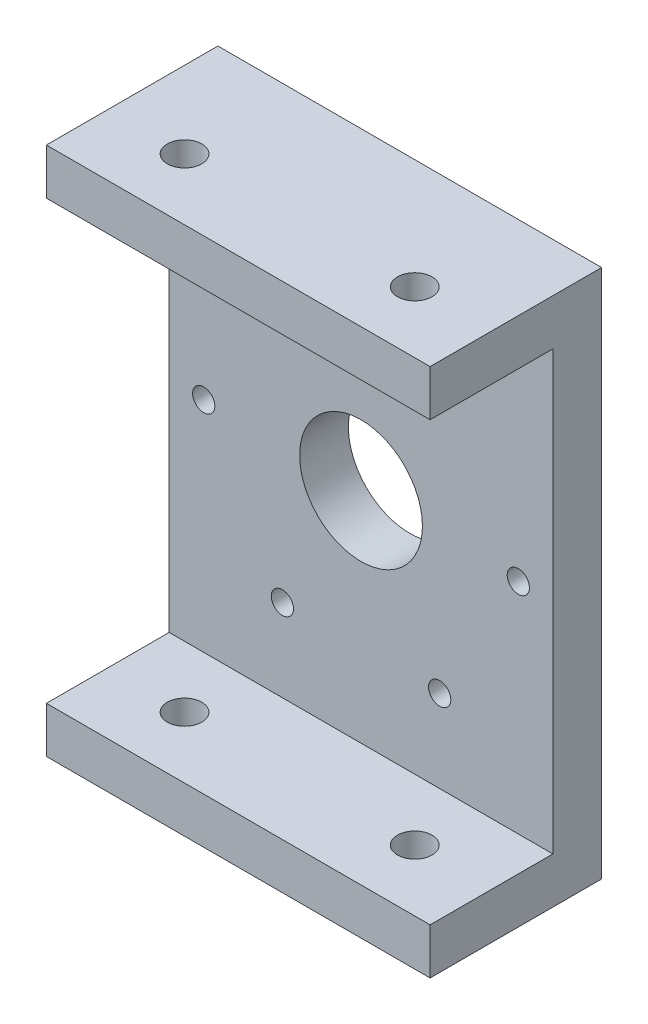
ISO-10303-21;
HEADER;
FILE_DESCRIPTION(('STEP AP214'),'2;1');
FILE_NAME('part.step','',(''),(''),'','','');
FILE_SCHEMA(('AUTOMOTIVE_DESIGN { 1 0 10303 214 1 1 1 1 }'));
ENDSEC;
DATA;
#1=APPLICATION_CONTEXT('core data for automotive mechanical design processes');
#2=APPLICATION_PROTOCOL_DEFINITION('international standard','automotive_design',2000,#1);
#3=PRODUCT_CONTEXT('',#1,'mechanical');
#4=PRODUCT('Part','Part','',(#3));
#5=PRODUCT_RELATED_PRODUCT_CATEGORY('part','',(#4));
#6=PRODUCT_DEFINITION_FORMATION('','',#4);
#7=PRODUCT_DEFINITION_CONTEXT('part definition',#1,'design');
#8=PRODUCT_DEFINITION('design','',#6,#7);
#9=PRODUCT_DEFINITION_SHAPE('','',#8);
#10=(LENGTH_UNIT() NAMED_UNIT(*) SI_UNIT(.MILLI.,.METRE.));
#11=(NAMED_UNIT(*) PLANE_ANGLE_UNIT() SI_UNIT($,.RADIAN.));
#12=(NAMED_UNIT(*) SI_UNIT($,.STERADIAN.) SOLID_ANGLE_UNIT());
#13=UNCERTAINTY_MEASURE_WITH_UNIT(LENGTH_MEASURE(1.E-05),#10,'distance_accuracy_value','');
#14=(GEOMETRIC_REPRESENTATION_CONTEXT(3) GLOBAL_UNCERTAINTY_ASSIGNED_CONTEXT((#13)) GLOBAL_UNIT_ASSIGNED_CONTEXT((#10,
#11,#12)) REPRESENTATION_CONTEXT('',''));
#15=CARTESIAN_POINT('',(0.,0.,0.));
#16=DIRECTION('',(0.,0.,1.));
#17=DIRECTION('',(1.,0.,0.));
#18=AXIS2_PLACEMENT_3D('',#15,#16,#17);
#19=CARTESIAN_POINT('',(0.,0.,526.));
#20=DIRECTION('',(0.,0.,-1.));
#21=DIRECTION('',(-1.,0.,0.));
#22=AXIS2_PLACEMENT_3D('',#19,#20,#21);
#23=PLANE('',#22);
#24=CARTESIAN_POINT('',(20.5,0.,526.));
#25=DIRECTION('',(0.,0.,1.));
#26=DIRECTION('',(1.,0.,0.));
#27=AXIS2_PLACEMENT_3D('',#24,#25,#26);
#28=CIRCLE('',#27,1.45);
#29=CARTESIAN_POINT('',(21.95,0.,526.));
#30=VERTEX_POINT('',#29);
#31=EDGE_CURVE('E160',#30,#30,#28,.T.);
#32=ORIENTED_EDGE('',*,*,#31,.F.);
#33=EDGE_LOOP('',(#32));
#34=FACE_BOUND('',#33,.T.);
#35=CARTESIAN_POINT('',(10.25,-17.753520777581,526.));
#36=DIRECTION('',(0.,0.,1.));
#37=DIRECTION('',(1.,0.,0.));
#38=AXIS2_PLACEMENT_3D('',#35,#36,#37);
#39=CIRCLE('',#38,1.45);
#40=CARTESIAN_POINT('',(11.7,-17.753520777581,526.));
#41=VERTEX_POINT('',#40);
#42=EDGE_CURVE('E138',#41,#41,#39,.T.);
#43=ORIENTED_EDGE('',*,*,#42,.F.);
#44=EDGE_LOOP('',(#43));
#45=FACE_BOUND('',#44,.T.);
#46=CARTESIAN_POINT('',(-10.25,-17.753520777581,526.));
#47=DIRECTION('',(0.,0.,1.));
#48=DIRECTION('',(1.,0.,0.));
#49=AXIS2_PLACEMENT_3D('',#46,#47,#48);
#50=CIRCLE('',#49,1.45);
#51=CARTESIAN_POINT('',(-8.80000000000001,-17.753520777581,526.));
#52=VERTEX_POINT('',#51);
#53=EDGE_CURVE('E166',#52,#52,#50,.T.);
#54=ORIENTED_EDGE('',*,*,#53,.F.);
#55=EDGE_LOOP('',(#54));
#56=FACE_BOUND('',#55,.T.);
#57=CARTESIAN_POINT('',(-20.5,0.,526.));
#58=DIRECTION('',(0.,0.,1.));
#59=DIRECTION('',(1.,0.,0.));
#60=AXIS2_PLACEMENT_3D('',#57,#58,#59);
#61=CIRCLE('',#60,1.45);
#62=CARTESIAN_POINT('',(-19.05,0.,526.));
#63=VERTEX_POINT('',#62);
#64=EDGE_CURVE('E184',#63,#63,#61,.T.);
#65=ORIENTED_EDGE('',*,*,#64,.F.);
#66=EDGE_LOOP('',(#65));
#67=FACE_BOUND('',#66,.T.);
#68=CARTESIAN_POINT('',(-10.25,17.753520777581,526.));
#69=DIRECTION('',(0.,0.,1.));
#70=DIRECTION('',(1.,0.,0.));
#71=AXIS2_PLACEMENT_3D('',#68,#69,#70);
#72=CIRCLE('',#71,1.45);
#73=CARTESIAN_POINT('',(-8.8,17.753520777581,526.));
#74=VERTEX_POINT('',#73);
#75=EDGE_CURVE('E177',#74,#74,#72,.T.);
#76=ORIENTED_EDGE('',*,*,#75,.F.);
#77=EDGE_LOOP('',(#76));
#78=FACE_BOUND('',#77,.T.);
#79=CARTESIAN_POINT('',(10.25,17.753520777581,526.));
#80=DIRECTION('',(0.,0.,1.));
#81=DIRECTION('',(1.,0.,0.));
#82=AXIS2_PLACEMENT_3D('',#79,#80,#81);
#83=CIRCLE('',#82,1.45);
#84=CARTESIAN_POINT('',(11.7,17.753520777581,526.));
#85=VERTEX_POINT('',#84);
#86=EDGE_CURVE('E173',#85,#85,#83,.T.);
#87=ORIENTED_EDGE('',*,*,#86,.F.);
#88=EDGE_LOOP('',(#87));
#89=FACE_BOUND('',#88,.T.);
#90=CARTESIAN_POINT('',(0.,0.,526.));
#91=DIRECTION('',(0.,0.,1.));
#92=DIRECTION('',(1.,0.,0.));
#93=AXIS2_PLACEMENT_3D('',#90,#91,#92);
#94=CIRCLE('',#93,8.);
#95=CARTESIAN_POINT('',(8.,0.,526.));
#96=VERTEX_POINT('',#95);
#97=EDGE_CURVE('E192',#96,#96,#94,.T.);
#98=ORIENTED_EDGE('',*,*,#97,.F.);
#99=EDGE_LOOP('',(#98));
#100=FACE_BOUND('',#99,.T.);
#101=DIRECTION('',(1.,0.,0.));
#102=VECTOR('',#101,1.);
#103=CARTESIAN_POINT('',(-25.,28.5,526.));
#104=LINE('',#103,#102);
#105=CARTESIAN_POINT('',(-25.,28.5,526.));
#106=VERTEX_POINT('',#105);
#107=CARTESIAN_POINT('',(25.,28.5,526.));
#108=VERTEX_POINT('',#107);
#109=EDGE_CURVE('E57',#106,#108,#104,.T.);
#110=ORIENTED_EDGE('',*,*,#109,.F.);
#111=DIRECTION('',(0.,-1.,0.));
#112=VECTOR('',#111,1.);
#113=CARTESIAN_POINT('',(-25.,-34.5,526.));
#114=LINE('',#113,#112);
#115=CARTESIAN_POINT('',(-25.,-28.5,526.));
#116=VERTEX_POINT('',#115);
#117=EDGE_CURVE('E197',#106,#116,#114,.T.);
#118=ORIENTED_EDGE('',*,*,#117,.T.);
#119=DIRECTION('',(-1.,0.,0.));
#120=VECTOR('',#119,1.);
#121=CARTESIAN_POINT('',(-25.,-28.5,526.));
#122=LINE('',#121,#120);
#123=CARTESIAN_POINT('',(25.,-28.5,526.));
#124=VERTEX_POINT('',#123);
#125=EDGE_CURVE('E63',#124,#116,#122,.T.);
#126=ORIENTED_EDGE('',*,*,#125,.F.);
#127=DIRECTION('',(0.,1.,0.));
#128=VECTOR('',#127,1.);
#129=CARTESIAN_POINT('',(25.,-34.5,526.));
#130=LINE('',#129,#128);
#131=EDGE_CURVE('E200',#124,#108,#130,.T.);
#132=ORIENTED_EDGE('',*,*,#131,.T.);
#133=EDGE_LOOP('',(#110,#118,#126,#132));
#134=FACE_BOUND('',#133,.T.);
#135=ADVANCED_FACE('F39',(#34,#45,#56,#67,#78,#89,#100,#134),#23,.F.);
#136=CARTESIAN_POINT('',(25.,-34.5,526.));
#137=DIRECTION('',(-1.,0.,0.));
#138=DIRECTION('',(0.,0.,1.));
#139=AXIS2_PLACEMENT_3D('',#136,#137,#138);
#140=PLANE('',#139);
#141=DIRECTION('',(0.,1.,0.));
#142=VECTOR('',#141,1.);
#143=CARTESIAN_POINT('',(25.,-34.5,519.65));
#144=LINE('',#143,#142);
#145=CARTESIAN_POINT('',(25.,-34.5,519.65));
#146=VERTEX_POINT('',#145);
#147=CARTESIAN_POINT('',(25.,34.5,519.65));
#148=VERTEX_POINT('',#147);
#149=EDGE_CURVE('E111',#146,#148,#144,.T.);
#150=ORIENTED_EDGE('',*,*,#149,.T.);
#151=DIRECTION('',(0.,0.,-1.));
#152=VECTOR('',#151,1.);
#153=CARTESIAN_POINT('',(25.,34.5,526.));
#154=LINE('',#153,#152);
#155=CARTESIAN_POINT('',(25.,34.5,542.));
#156=VERTEX_POINT('',#155);
#157=EDGE_CURVE('E11',#156,#148,#154,.T.);
#158=ORIENTED_EDGE('',*,*,#157,.F.);
#159=DIRECTION('',(0.,1.,0.));
#160=VECTOR('',#159,1.);
#161=CARTESIAN_POINT('',(25.,28.5,542.));
#162=LINE('',#161,#160);
#163=CARTESIAN_POINT('',(25.,28.5,542.));
#164=VERTEX_POINT('',#163);
#165=EDGE_CURVE('E108',#164,#156,#162,.T.);
#166=ORIENTED_EDGE('',*,*,#165,.F.);
#167=DIRECTION('',(0.,0.,-1.));
#168=VECTOR('',#167,1.);
#169=CARTESIAN_POINT('',(25.,28.5,542.));
#170=LINE('',#169,#168);
#171=EDGE_CURVE('E131',#164,#108,#170,.T.);
#172=ORIENTED_EDGE('',*,*,#171,.T.);
#173=ORIENTED_EDGE('',*,*,#131,.F.);
#174=DIRECTION('',(0.,0.,-1.));
#175=VECTOR('',#174,1.);
#176=CARTESIAN_POINT('',(25.,-28.5,542.));
#177=LINE('',#176,#175);
#178=CARTESIAN_POINT('',(25.,-28.5,542.));
#179=VERTEX_POINT('',#178);
#180=EDGE_CURVE('E137',#179,#124,#177,.T.);
#181=ORIENTED_EDGE('',*,*,#180,.F.);
#182=DIRECTION('',(0.,1.,0.));
#183=VECTOR('',#182,1.);
#184=CARTESIAN_POINT('',(25.,-34.5,542.));
#185=LINE('',#184,#183);
#186=CARTESIAN_POINT('',(25.,-34.5,542.));
#187=VERTEX_POINT('',#186);
#188=EDGE_CURVE('E149',#187,#179,#185,.T.);
#189=ORIENTED_EDGE('',*,*,#188,.F.);
#190=DIRECTION('',(0.,0.,-1.));
#191=VECTOR('',#190,1.);
#192=CARTESIAN_POINT('',(25.,-34.5,526.));
#193=LINE('',#192,#191);
#194=EDGE_CURVE('E203',#187,#146,#193,.T.);
#195=ORIENTED_EDGE('',*,*,#194,.T.);
#196=EDGE_LOOP('',(#150,#158,#166,#172,#173,#181,#189,#195));
#197=FACE_BOUND('',#196,.T.);
#198=ADVANCED_FACE('F41',(#197),#140,.F.);
#199=CARTESIAN_POINT('',(-25.,34.5,526.));
#200=DIRECTION('',(0.,-1.,0.));
#201=DIRECTION('',(0.,0.,-1.));
#202=AXIS2_PLACEMENT_3D('',#199,#200,#201);
#203=PLANE('',#202);
#204=CARTESIAN_POINT('',(-15.,34.5,534.));
#205=DIRECTION('',(0.,1.,0.));
#206=DIRECTION('',(0.,0.,1.));
#207=AXIS2_PLACEMENT_3D('',#204,#205,#206);
#208=CIRCLE('',#207,2.25);
#209=CARTESIAN_POINT('',(-15.,34.5,536.25));
#210=VERTEX_POINT('',#209);
#211=EDGE_CURVE('E216',#210,#210,#208,.T.);
#212=ORIENTED_EDGE('',*,*,#211,.F.);
#213=EDGE_LOOP('',(#212));
#214=FACE_BOUND('',#213,.T.);
#215=CARTESIAN_POINT('',(15.,34.5,534.));
#216=DIRECTION('',(0.,1.,0.));
#217=DIRECTION('',(0.,0.,1.));
#218=AXIS2_PLACEMENT_3D('',#215,#216,#217);
#219=CIRCLE('',#218,2.25);
#220=CARTESIAN_POINT('',(15.,34.5,536.25));
#221=VERTEX_POINT('',#220);
#222=EDGE_CURVE('E235',#221,#221,#219,.T.);
#223=ORIENTED_EDGE('',*,*,#222,.F.);
#224=EDGE_LOOP('',(#223));
#225=FACE_BOUND('',#224,.T.);
#226=DIRECTION('',(-1.,0.,0.));
#227=VECTOR('',#226,1.);
#228=CARTESIAN_POINT('',(-25.,34.5,519.65));
#229=LINE('',#228,#227);
#230=CARTESIAN_POINT('',(-25.,34.5,519.65));
#231=VERTEX_POINT('',#230);
#232=EDGE_CURVE('E204',#148,#231,#229,.T.);
#233=ORIENTED_EDGE('',*,*,#232,.T.);
#234=DIRECTION('',(0.,0.,-1.));
#235=VECTOR('',#234,1.);
#236=CARTESIAN_POINT('',(-25.,34.5,526.));
#237=LINE('',#236,#235);
#238=CARTESIAN_POINT('',(-25.,34.5,542.));
#239=VERTEX_POINT('',#238);
#240=EDGE_CURVE('E48',#239,#231,#237,.T.);
#241=ORIENTED_EDGE('',*,*,#240,.F.);
#242=DIRECTION('',(-1.,0.,0.));
#243=VECTOR('',#242,1.);
#244=CARTESIAN_POINT('',(-25.,34.5,542.));
#245=LINE('',#244,#243);
#246=EDGE_CURVE('E112',#156,#239,#245,.T.);
#247=ORIENTED_EDGE('',*,*,#246,.F.);
#248=ORIENTED_EDGE('',*,*,#157,.T.);
#249=EDGE_LOOP('',(#233,#241,#247,#248));
#250=FACE_BOUND('',#249,.T.);
#251=ADVANCED_FACE('F114',(#214,#225,#250),#203,.F.);
#252=CARTESIAN_POINT('',(-25.,-34.5,526.));
#253=DIRECTION('',(1.,0.,0.));
#254=DIRECTION('',(0.,0.,-1.));
#255=AXIS2_PLACEMENT_3D('',#252,#253,#254);
#256=PLANE('',#255);
#257=DIRECTION('',(0.,-1.,0.));
#258=VECTOR('',#257,1.);
#259=CARTESIAN_POINT('',(-25.,-34.5,519.65));
#260=LINE('',#259,#258);
#261=CARTESIAN_POINT('',(-25.,-34.5,519.65));
#262=VERTEX_POINT('',#261);
#263=EDGE_CURVE('E210',#231,#262,#260,.T.);
#264=ORIENTED_EDGE('',*,*,#263,.T.);
#265=DIRECTION('',(0.,0.,-1.));
#266=VECTOR('',#265,1.);
#267=CARTESIAN_POINT('',(-25.,-34.5,526.));
#268=LINE('',#267,#266);
#269=CARTESIAN_POINT('',(-25.,-34.5,542.));
#270=VERTEX_POINT('',#269);
#271=EDGE_CURVE('E213',#270,#262,#268,.T.);
#272=ORIENTED_EDGE('',*,*,#271,.F.);
#273=DIRECTION('',(0.,-1.,0.));
#274=VECTOR('',#273,1.);
#275=CARTESIAN_POINT('',(-25.,-34.5,542.));
#276=LINE('',#275,#274);
#277=CARTESIAN_POINT('',(-25.,-28.5,542.));
#278=VERTEX_POINT('',#277);
#279=EDGE_CURVE('E146',#278,#270,#276,.T.);
#280=ORIENTED_EDGE('',*,*,#279,.F.);
#281=DIRECTION('',(0.,0.,-1.));
#282=VECTOR('',#281,1.);
#283=CARTESIAN_POINT('',(-25.,-28.5,542.));
#284=LINE('',#283,#282);
#285=EDGE_CURVE('E145',#278,#116,#284,.T.);
#286=ORIENTED_EDGE('',*,*,#285,.T.);
#287=ORIENTED_EDGE('',*,*,#117,.F.);
#288=DIRECTION('',(0.,0.,-1.));
#289=VECTOR('',#288,1.);
#290=CARTESIAN_POINT('',(-25.,28.5,542.));
#291=LINE('',#290,#289);
#292=CARTESIAN_POINT('',(-25.,28.5,542.));
#293=VERTEX_POINT('',#292);
#294=EDGE_CURVE('E132',#293,#106,#291,.T.);
#295=ORIENTED_EDGE('',*,*,#294,.F.);
#296=DIRECTION('',(0.,-1.,0.));
#297=VECTOR('',#296,1.);
#298=CARTESIAN_POINT('',(-25.,28.5,542.));
#299=LINE('',#298,#297);
#300=EDGE_CURVE('E118',#239,#293,#299,.T.);
#301=ORIENTED_EDGE('',*,*,#300,.F.);
#302=ORIENTED_EDGE('',*,*,#240,.T.);
#303=EDGE_LOOP('',(#264,#272,#280,#286,#287,#295,#301,#302));
#304=FACE_BOUND('',#303,.T.);
#305=ADVANCED_FACE('F237',(#304),#256,.F.);
#306=CARTESIAN_POINT('',(-25.,-34.5,526.));
#307=DIRECTION('',(0.,1.,0.));
#308=DIRECTION('',(0.,0.,1.));
#309=AXIS2_PLACEMENT_3D('',#306,#307,#308);
#310=PLANE('',#309);
#311=CARTESIAN_POINT('',(-15.,-34.5,534.));
#312=DIRECTION('',(0.,1.,0.));
#313=DIRECTION('',(0.,0.,1.));
#314=AXIS2_PLACEMENT_3D('',#311,#312,#313);
#315=CIRCLE('',#314,2.25);
#316=CARTESIAN_POINT('',(-15.,-34.5,536.25));
#317=VERTEX_POINT('',#316);
#318=EDGE_CURVE('E225',#317,#317,#315,.T.);
#319=ORIENTED_EDGE('',*,*,#318,.T.);
#320=EDGE_LOOP('',(#319));
#321=FACE_BOUND('',#320,.T.);
#322=CARTESIAN_POINT('',(15.,-34.5,534.));
#323=DIRECTION('',(0.,1.,0.));
#324=DIRECTION('',(0.,0.,1.));
#325=AXIS2_PLACEMENT_3D('',#322,#323,#324);
#326=CIRCLE('',#325,2.25);
#327=CARTESIAN_POINT('',(15.,-34.5,536.25));
#328=VERTEX_POINT('',#327);
#329=EDGE_CURVE('E227',#328,#328,#326,.T.);
#330=ORIENTED_EDGE('',*,*,#329,.T.);
#331=EDGE_LOOP('',(#330));
#332=FACE_BOUND('',#331,.T.);
#333=DIRECTION('',(1.,0.,0.));
#334=VECTOR('',#333,1.);
#335=CARTESIAN_POINT('',(-25.,-34.5,519.65));
#336=LINE('',#335,#334);
#337=EDGE_CURVE('E201',#262,#146,#336,.T.);
#338=ORIENTED_EDGE('',*,*,#337,.T.);
#339=ORIENTED_EDGE('',*,*,#194,.F.);
#340=DIRECTION('',(1.,0.,0.));
#341=VECTOR('',#340,1.);
#342=CARTESIAN_POINT('',(-25.,-34.5,542.));
#343=LINE('',#342,#341);
#344=EDGE_CURVE('E143',#270,#187,#343,.T.);
#345=ORIENTED_EDGE('',*,*,#344,.F.);
#346=ORIENTED_EDGE('',*,*,#271,.T.);
#347=EDGE_LOOP('',(#338,#339,#345,#346));
#348=FACE_BOUND('',#347,.T.);
#349=ADVANCED_FACE('F250',(#321,#332,#348),#310,.F.);
#350=CARTESIAN_POINT('',(0.,0.,519.65));
#351=DIRECTION('',(0.,0.,-1.));
#352=DIRECTION('',(-1.,0.,0.));
#353=AXIS2_PLACEMENT_3D('',#350,#351,#352);
#354=PLANE('',#353);
#355=CARTESIAN_POINT('',(20.5,0.,519.65));
#356=DIRECTION('',(0.,0.,1.));
#357=DIRECTION('',(1.,0.,0.));
#358=AXIS2_PLACEMENT_3D('',#355,#356,#357);
#359=CIRCLE('',#358,1.45);
#360=CARTESIAN_POINT('',(21.95,0.,519.65));
#361=VERTEX_POINT('',#360);
#362=EDGE_CURVE('E163',#361,#361,#359,.T.);
#363=ORIENTED_EDGE('',*,*,#362,.T.);
#364=EDGE_LOOP('',(#363));
#365=FACE_BOUND('',#364,.T.);
#366=CARTESIAN_POINT('',(10.25,-17.753520777581,519.65));
#367=DIRECTION('',(0.,0.,1.));
#368=DIRECTION('',(1.,0.,0.));
#369=AXIS2_PLACEMENT_3D('',#366,#367,#368);
#370=CIRCLE('',#369,1.45);
#371=CARTESIAN_POINT('',(11.7,-17.753520777581,519.65));
#372=VERTEX_POINT('',#371);
#373=EDGE_CURVE('E164',#372,#372,#370,.T.);
#374=ORIENTED_EDGE('',*,*,#373,.T.);
#375=EDGE_LOOP('',(#374));
#376=FACE_BOUND('',#375,.T.);
#377=CARTESIAN_POINT('',(-10.25,-17.753520777581,519.65));
#378=DIRECTION('',(0.,0.,1.));
#379=DIRECTION('',(1.,0.,0.));
#380=AXIS2_PLACEMENT_3D('',#377,#378,#379);
#381=CIRCLE('',#380,1.45);
#382=CARTESIAN_POINT('',(-8.80000000000001,-17.753520777581,519.65));
#383=VERTEX_POINT('',#382);
#384=EDGE_CURVE('E189',#383,#383,#381,.T.);
#385=ORIENTED_EDGE('',*,*,#384,.T.);
#386=EDGE_LOOP('',(#385));
#387=FACE_BOUND('',#386,.T.);
#388=CARTESIAN_POINT('',(-20.5,0.,519.65));
#389=DIRECTION('',(0.,0.,1.));
#390=DIRECTION('',(1.,0.,0.));
#391=AXIS2_PLACEMENT_3D('',#388,#389,#390);
#392=CIRCLE('',#391,1.45);
#393=CARTESIAN_POINT('',(-19.05,0.,519.65));
#394=VERTEX_POINT('',#393);
#395=EDGE_CURVE('E185',#394,#394,#392,.T.);
#396=ORIENTED_EDGE('',*,*,#395,.T.);
#397=EDGE_LOOP('',(#396));
#398=FACE_BOUND('',#397,.T.);
#399=CARTESIAN_POINT('',(-10.25,17.753520777581,519.65));
#400=DIRECTION('',(0.,0.,1.));
#401=DIRECTION('',(1.,0.,0.));
#402=AXIS2_PLACEMENT_3D('',#399,#400,#401);
#403=CIRCLE('',#402,1.45);
#404=CARTESIAN_POINT('',(-8.8,17.753520777581,519.65));
#405=VERTEX_POINT('',#404);
#406=EDGE_CURVE('E176',#405,#405,#403,.T.);
#407=ORIENTED_EDGE('',*,*,#406,.T.);
#408=EDGE_LOOP('',(#407));
#409=FACE_BOUND('',#408,.T.);
#410=CARTESIAN_POINT('',(10.25,17.753520777581,519.65));
#411=DIRECTION('',(0.,0.,1.));
#412=DIRECTION('',(1.,0.,0.));
#413=AXIS2_PLACEMENT_3D('',#410,#411,#412);
#414=CIRCLE('',#413,1.45);
#415=CARTESIAN_POINT('',(11.7,17.753520777581,519.65));
#416=VERTEX_POINT('',#415);
#417=EDGE_CURVE('E165',#416,#416,#414,.T.);
#418=ORIENTED_EDGE('',*,*,#417,.T.);
#419=EDGE_LOOP('',(#418));
#420=FACE_BOUND('',#419,.T.);
#421=CARTESIAN_POINT('',(0.,0.,519.65));
#422=DIRECTION('',(0.,0.,1.));
#423=DIRECTION('',(1.,0.,0.));
#424=AXIS2_PLACEMENT_3D('',#421,#422,#423);
#425=CIRCLE('',#424,8.);
#426=CARTESIAN_POINT('',(8.,0.,519.65));
#427=VERTEX_POINT('',#426);
#428=EDGE_CURVE('E159',#427,#427,#425,.T.);
#429=ORIENTED_EDGE('',*,*,#428,.T.);
#430=EDGE_LOOP('',(#429));
#431=FACE_BOUND('',#430,.T.);
#432=ORIENTED_EDGE('',*,*,#149,.F.);
#433=ORIENTED_EDGE('',*,*,#337,.F.);
#434=ORIENTED_EDGE('',*,*,#263,.F.);
#435=ORIENTED_EDGE('',*,*,#232,.F.);
#436=EDGE_LOOP('',(#432,#433,#434,#435));
#437=FACE_BOUND('',#436,.T.);
#438=ADVANCED_FACE('F263',(#365,#376,#387,#398,#409,#420,#431,#437),#354,.T.);
#439=CARTESIAN_POINT('',(0.,0.,526.));
#440=DIRECTION('',(0.,0.,-1.));
#441=DIRECTION('',(-1.,0.,0.));
#442=AXIS2_PLACEMENT_3D('',#439,#440,#441);
#443=CYLINDRICAL_SURFACE('',#442,8.);
#444=ORIENTED_EDGE('',*,*,#97,.T.);
#445=EDGE_LOOP('',(#444));
#446=FACE_BOUND('',#445,.T.);
#447=ORIENTED_EDGE('',*,*,#428,.F.);
#448=EDGE_LOOP('',(#447));
#449=FACE_BOUND('',#448,.T.);
#450=ADVANCED_FACE('F261',(#446,#449),#443,.F.);
#451=CARTESIAN_POINT('',(10.25,17.753520777581,526.));
#452=DIRECTION('',(0.,0.,-1.));
#453=DIRECTION('',(-1.,0.,0.));
#454=AXIS2_PLACEMENT_3D('',#451,#452,#453);
#455=CYLINDRICAL_SURFACE('',#454,1.45);
#456=ORIENTED_EDGE('',*,*,#86,.T.);
#457=EDGE_LOOP('',(#456));
#458=FACE_BOUND('',#457,.T.);
#459=ORIENTED_EDGE('',*,*,#417,.F.);
#460=EDGE_LOOP('',(#459));
#461=FACE_BOUND('',#460,.T.);
#462=ADVANCED_FACE('F315',(#458,#461),#455,.F.);
#463=CARTESIAN_POINT('',(-10.25,17.753520777581,526.));
#464=DIRECTION('',(0.,0.,-1.));
#465=DIRECTION('',(-1.,0.,0.));
#466=AXIS2_PLACEMENT_3D('',#463,#464,#465);
#467=CYLINDRICAL_SURFACE('',#466,1.45);
#468=ORIENTED_EDGE('',*,*,#75,.T.);
#469=EDGE_LOOP('',(#468));
#470=FACE_BOUND('',#469,.T.);
#471=ORIENTED_EDGE('',*,*,#406,.F.);
#472=EDGE_LOOP('',(#471));
#473=FACE_BOUND('',#472,.T.);
#474=ADVANCED_FACE('F314',(#470,#473),#467,.F.);
#475=CARTESIAN_POINT('',(-20.5,0.,526.));
#476=DIRECTION('',(0.,0.,-1.));
#477=DIRECTION('',(-1.,0.,0.));
#478=AXIS2_PLACEMENT_3D('',#475,#476,#477);
#479=CYLINDRICAL_SURFACE('',#478,1.45);
#480=ORIENTED_EDGE('',*,*,#64,.T.);
#481=EDGE_LOOP('',(#480));
#482=FACE_BOUND('',#481,.T.);
#483=ORIENTED_EDGE('',*,*,#395,.F.);
#484=EDGE_LOOP('',(#483));
#485=FACE_BOUND('',#484,.T.);
#486=ADVANCED_FACE('F316',(#482,#485),#479,.F.);
#487=CARTESIAN_POINT('',(-10.25,-17.753520777581,526.));
#488=DIRECTION('',(0.,0.,-1.));
#489=DIRECTION('',(-1.,0.,0.));
#490=AXIS2_PLACEMENT_3D('',#487,#488,#489);
#491=CYLINDRICAL_SURFACE('',#490,1.45);
#492=ORIENTED_EDGE('',*,*,#53,.T.);
#493=EDGE_LOOP('',(#492));
#494=FACE_BOUND('',#493,.T.);
#495=ORIENTED_EDGE('',*,*,#384,.F.);
#496=EDGE_LOOP('',(#495));
#497=FACE_BOUND('',#496,.T.);
#498=ADVANCED_FACE('F309',(#494,#497),#491,.F.);
#499=CARTESIAN_POINT('',(10.25,-17.753520777581,526.));
#500=DIRECTION('',(0.,0.,-1.));
#501=DIRECTION('',(-1.,0.,0.));
#502=AXIS2_PLACEMENT_3D('',#499,#500,#501);
#503=CYLINDRICAL_SURFACE('',#502,1.45);
#504=ORIENTED_EDGE('',*,*,#42,.T.);
#505=EDGE_LOOP('',(#504));
#506=FACE_BOUND('',#505,.T.);
#507=ORIENTED_EDGE('',*,*,#373,.F.);
#508=EDGE_LOOP('',(#507));
#509=FACE_BOUND('',#508,.T.);
#510=ADVANCED_FACE('F306',(#506,#509),#503,.F.);
#511=CARTESIAN_POINT('',(20.5,0.,526.));
#512=DIRECTION('',(0.,0.,-1.));
#513=DIRECTION('',(-1.,0.,0.));
#514=AXIS2_PLACEMENT_3D('',#511,#512,#513);
#515=CYLINDRICAL_SURFACE('',#514,1.45);
#516=ORIENTED_EDGE('',*,*,#31,.T.);
#517=EDGE_LOOP('',(#516));
#518=FACE_BOUND('',#517,.T.);
#519=ORIENTED_EDGE('',*,*,#362,.F.);
#520=EDGE_LOOP('',(#519));
#521=FACE_BOUND('',#520,.T.);
#522=ADVANCED_FACE('F301',(#518,#521),#515,.F.);
#523=CARTESIAN_POINT('',(-25.,-28.5,542.));
#524=DIRECTION('',(0.,-1.,0.));
#525=DIRECTION('',(0.,0.,-1.));
#526=AXIS2_PLACEMENT_3D('',#523,#524,#525);
#527=PLANE('',#526);
#528=CARTESIAN_POINT('',(-15.,-28.5,534.));
#529=DIRECTION('',(0.,-1.,0.));
#530=DIRECTION('',(0.,0.,-1.));
#531=AXIS2_PLACEMENT_3D('',#528,#529,#530);
#532=CIRCLE('',#531,2.25);
#533=CARTESIAN_POINT('',(-15.,-28.5,531.75));
#534=VERTEX_POINT('',#533);
#535=EDGE_CURVE('E127',#534,#534,#532,.F.);
#536=ORIENTED_EDGE('',*,*,#535,.F.);
#537=EDGE_LOOP('',(#536));
#538=FACE_BOUND('',#537,.T.);
#539=CARTESIAN_POINT('',(15.,-28.5,534.));
#540=DIRECTION('',(0.,-1.,0.));
#541=DIRECTION('',(0.,0.,-1.));
#542=AXIS2_PLACEMENT_3D('',#539,#540,#541);
#543=CIRCLE('',#542,2.25);
#544=CARTESIAN_POINT('',(15.,-28.5,531.75));
#545=VERTEX_POINT('',#544);
#546=EDGE_CURVE('E219',#545,#545,#543,.F.);
#547=ORIENTED_EDGE('',*,*,#546,.F.);
#548=EDGE_LOOP('',(#547));
#549=FACE_BOUND('',#548,.T.);
#550=ORIENTED_EDGE('',*,*,#125,.T.);
#551=ORIENTED_EDGE('',*,*,#285,.F.);
#552=DIRECTION('',(-1.,0.,0.));
#553=VECTOR('',#552,1.);
#554=CARTESIAN_POINT('',(-25.,-28.5,542.));
#555=LINE('',#554,#553);
#556=EDGE_CURVE('E155',#179,#278,#555,.T.);
#557=ORIENTED_EDGE('',*,*,#556,.F.);
#558=ORIENTED_EDGE('',*,*,#180,.T.);
#559=EDGE_LOOP('',(#550,#551,#557,#558));
#560=FACE_BOUND('',#559,.T.);
#561=ADVANCED_FACE('F288',(#538,#549,#560),#527,.F.);
#562=CARTESIAN_POINT('',(0.,0.,542.));
#563=DIRECTION('',(0.,0.,-1.));
#564=DIRECTION('',(-1.,0.,0.));
#565=AXIS2_PLACEMENT_3D('',#562,#563,#564);
#566=PLANE('',#565);
#567=ORIENTED_EDGE('',*,*,#188,.T.);
#568=ORIENTED_EDGE('',*,*,#556,.T.);
#569=ORIENTED_EDGE('',*,*,#279,.T.);
#570=ORIENTED_EDGE('',*,*,#344,.T.);
#571=EDGE_LOOP('',(#567,#568,#569,#570));
#572=FACE_BOUND('',#571,.T.);
#573=ADVANCED_FACE('F292',(#572),#566,.F.);
#574=CARTESIAN_POINT('',(-25.,28.5,542.));
#575=DIRECTION('',(0.,1.,0.));
#576=DIRECTION('',(0.,0.,1.));
#577=AXIS2_PLACEMENT_3D('',#574,#575,#576);
#578=PLANE('',#577);
#579=CARTESIAN_POINT('',(-15.,28.5,534.));
#580=DIRECTION('',(0.,1.,0.));
#581=DIRECTION('',(0.,0.,1.));
#582=AXIS2_PLACEMENT_3D('',#579,#580,#581);
#583=CIRCLE('',#582,2.25);
#584=CARTESIAN_POINT('',(-15.,28.5,536.25));
#585=VERTEX_POINT('',#584);
#586=EDGE_CURVE('E43',#585,#585,#583,.F.);
#587=ORIENTED_EDGE('',*,*,#586,.F.);
#588=EDGE_LOOP('',(#587));
#589=FACE_BOUND('',#588,.T.);
#590=CARTESIAN_POINT('',(15.,28.5,534.));
#591=DIRECTION('',(0.,1.,0.));
#592=DIRECTION('',(0.,0.,1.));
#593=AXIS2_PLACEMENT_3D('',#590,#591,#592);
#594=CIRCLE('',#593,2.25);
#595=CARTESIAN_POINT('',(15.,28.5,536.25));
#596=VERTEX_POINT('',#595);
#597=EDGE_CURVE('E215',#596,#596,#594,.F.);
#598=ORIENTED_EDGE('',*,*,#597,.F.);
#599=EDGE_LOOP('',(#598));
#600=FACE_BOUND('',#599,.T.);
#601=ORIENTED_EDGE('',*,*,#109,.T.);
#602=ORIENTED_EDGE('',*,*,#171,.F.);
#603=DIRECTION('',(1.,0.,0.));
#604=VECTOR('',#603,1.);
#605=CARTESIAN_POINT('',(-25.,28.5,542.));
#606=LINE('',#605,#604);
#607=EDGE_CURVE('E124',#293,#164,#606,.T.);
#608=ORIENTED_EDGE('',*,*,#607,.F.);
#609=ORIENTED_EDGE('',*,*,#294,.T.);
#610=EDGE_LOOP('',(#601,#602,#608,#609));
#611=FACE_BOUND('',#610,.T.);
#612=ADVANCED_FACE('F286',(#589,#600,#611),#578,.F.);
#613=CARTESIAN_POINT('',(0.,0.,542.));
#614=DIRECTION('',(0.,0.,-1.));
#615=DIRECTION('',(-1.,0.,0.));
#616=AXIS2_PLACEMENT_3D('',#613,#614,#615);
#617=PLANE('',#616);
#618=ORIENTED_EDGE('',*,*,#165,.T.);
#619=ORIENTED_EDGE('',*,*,#246,.T.);
#620=ORIENTED_EDGE('',*,*,#300,.T.);
#621=ORIENTED_EDGE('',*,*,#607,.T.);
#622=EDGE_LOOP('',(#618,#619,#620,#621));
#623=FACE_BOUND('',#622,.T.);
#624=ADVANCED_FACE('F122',(#623),#617,.F.);
#625=CARTESIAN_POINT('',(15.,34.5,534.));
#626=DIRECTION('',(0.,-1.,0.));
#627=DIRECTION('',(0.,0.,-1.));
#628=AXIS2_PLACEMENT_3D('',#625,#626,#627);
#629=CYLINDRICAL_SURFACE('',#628,2.25);
#630=ORIENTED_EDGE('',*,*,#222,.T.);
#631=EDGE_LOOP('',(#630));
#632=FACE_BOUND('',#631,.T.);
#633=ORIENTED_EDGE('',*,*,#597,.T.);
#634=EDGE_LOOP('',(#633));
#635=FACE_BOUND('',#634,.T.);
#636=ADVANCED_FACE('F236',(#632,#635),#629,.F.);
#637=CARTESIAN_POINT('',(-15.,34.5,534.));
#638=DIRECTION('',(0.,-1.,0.));
#639=DIRECTION('',(0.,0.,-1.));
#640=AXIS2_PLACEMENT_3D('',#637,#638,#639);
#641=CYLINDRICAL_SURFACE('',#640,2.25);
#642=ORIENTED_EDGE('',*,*,#211,.T.);
#643=EDGE_LOOP('',(#642));
#644=FACE_BOUND('',#643,.T.);
#645=ORIENTED_EDGE('',*,*,#586,.T.);
#646=EDGE_LOOP('',(#645));
#647=FACE_BOUND('',#646,.T.);
#648=ADVANCED_FACE('F395',(#644,#647),#641,.F.);
#649=ORIENTED_EDGE('',*,*,#329,.F.);
#650=EDGE_LOOP('',(#649));
#651=FACE_BOUND('',#650,.T.);
#652=ORIENTED_EDGE('',*,*,#546,.T.);
#653=EDGE_LOOP('',(#652));
#654=FACE_BOUND('',#653,.T.);
#655=ADVANCED_FACE('F392',(#651,#654),#629,.F.);
#656=ORIENTED_EDGE('',*,*,#318,.F.);
#657=EDGE_LOOP('',(#656));
#658=FACE_BOUND('',#657,.T.);
#659=ORIENTED_EDGE('',*,*,#535,.T.);
#660=EDGE_LOOP('',(#659));
#661=FACE_BOUND('',#660,.T.);
#662=ADVANCED_FACE('F405',(#658,#661),#641,.F.);
#663=CLOSED_SHELL('',(#135,#198,#251,#305,#349,#438,#450,#462,#474,#486,#498,#510,#522,#561,
#573,#612,#624,#636,#648,#655,#662));
#664=MANIFOLD_SOLID_BREP('B2',#663);
#665=ADVANCED_BREP_SHAPE_REPRESENTATION('',(#18,#664),#14);
#666=SHAPE_DEFINITION_REPRESENTATION(#9,#665);
ENDSEC;
END-ISO-10303-21;
